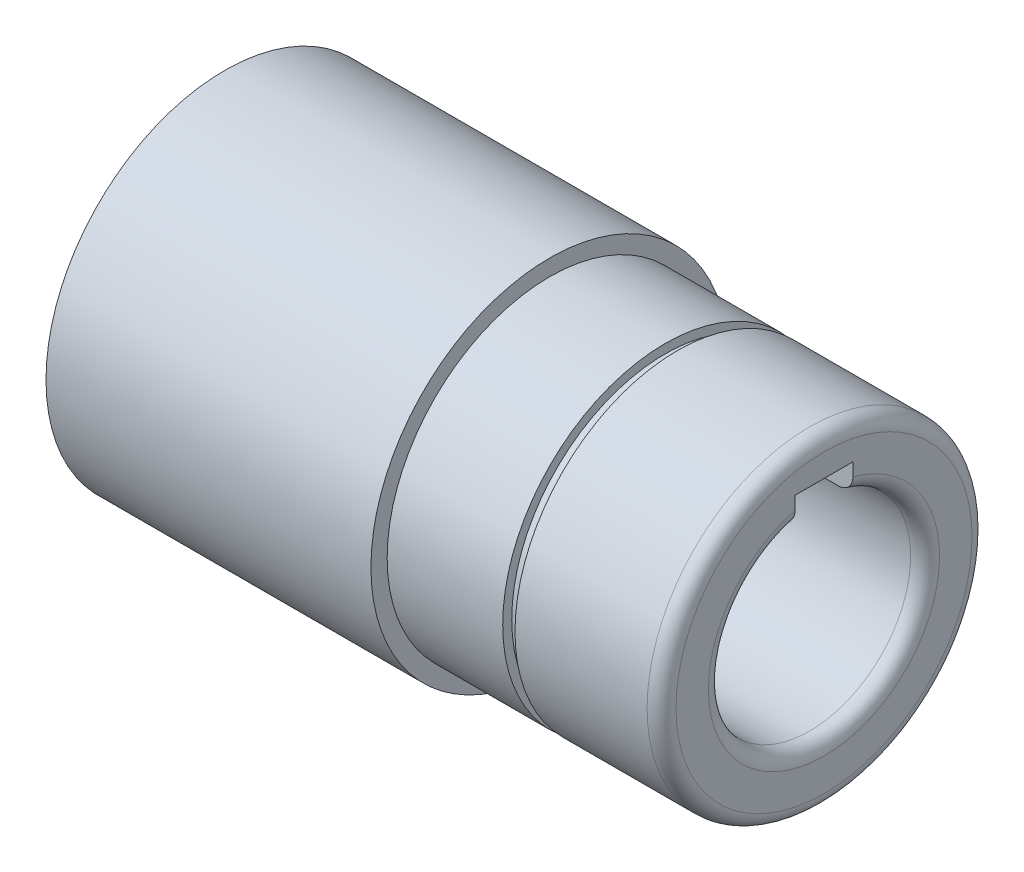
ISO-10303-21;
HEADER;
FILE_DESCRIPTION(('STEP AP214'),'2;1');
FILE_NAME('part.step','',(''),(''),'','','');
FILE_SCHEMA(('AUTOMOTIVE_DESIGN { 1 0 10303 214 1 1 1 1 }'));
ENDSEC;
DATA;
#1=APPLICATION_CONTEXT('core data for automotive mechanical design processes');
#2=APPLICATION_PROTOCOL_DEFINITION('international standard','automotive_design',2000,#1);
#3=PRODUCT_CONTEXT('',#1,'mechanical');
#4=PRODUCT('Part','Part','',(#3));
#5=PRODUCT_RELATED_PRODUCT_CATEGORY('part','',(#4));
#6=PRODUCT_DEFINITION_FORMATION('','',#4);
#7=PRODUCT_DEFINITION_CONTEXT('part definition',#1,'design');
#8=PRODUCT_DEFINITION('design','',#6,#7);
#9=PRODUCT_DEFINITION_SHAPE('','',#8);
#10=(LENGTH_UNIT() NAMED_UNIT(*) SI_UNIT(.MILLI.,.METRE.));
#11=(NAMED_UNIT(*) PLANE_ANGLE_UNIT() SI_UNIT($,.RADIAN.));
#12=(NAMED_UNIT(*) SI_UNIT($,.STERADIAN.) SOLID_ANGLE_UNIT());
#13=UNCERTAINTY_MEASURE_WITH_UNIT(LENGTH_MEASURE(1.E-05),#10,'distance_accuracy_value','');
#14=(GEOMETRIC_REPRESENTATION_CONTEXT(3) GLOBAL_UNCERTAINTY_ASSIGNED_CONTEXT((#13)) GLOBAL_UNIT_ASSIGNED_CONTEXT((#10,
#11,#12)) REPRESENTATION_CONTEXT('',''));
#15=CARTESIAN_POINT('',(0.,0.,0.));
#16=DIRECTION('',(0.,0.,1.));
#17=DIRECTION('',(1.,0.,0.));
#18=AXIS2_PLACEMENT_3D('',#15,#16,#17);
#19=CARTESIAN_POINT('',(-32.6241134751773,0.,0.));
#20=DIRECTION('',(-1.,0.,0.));
#21=DIRECTION('',(0.,0.,1.));
#22=AXIS2_PLACEMENT_3D('',#19,#20,#21);
#23=CYLINDRICAL_SURFACE('',#22,10.);
#24=CARTESIAN_POINT('',(0.,0.,0.));
#25=DIRECTION('',(-1.,0.,0.));
#26=DIRECTION('',(0.,0.,1.));
#27=AXIS2_PLACEMENT_3D('',#24,#25,#26);
#28=CIRCLE('',#27,10.);
#29=CARTESIAN_POINT('',(0.,9.68245836551854,-2.5));
#30=VERTEX_POINT('',#29);
#31=CARTESIAN_POINT('',(0.,9.68245836551854,2.5));
#32=VERTEX_POINT('',#31);
#33=EDGE_CURVE('E314',#30,#32,#28,.T.);
#34=ORIENTED_EDGE('',*,*,#33,.T.);
#35=DIRECTION('',(-1.,0.,0.));
#36=VECTOR('',#35,1.);
#37=CARTESIAN_POINT('',(-32.6241134751773,9.68245836551854,2.5));
#38=LINE('',#37,#36);
#39=CARTESIAN_POINT('',(22.5,9.68245836551854,2.5));
#40=VERTEX_POINT('',#39);
#41=EDGE_CURVE('E294',#40,#32,#38,.T.);
#42=ORIENTED_EDGE('',*,*,#41,.F.);
#43=CARTESIAN_POINT('',(22.5,0.,0.));
#44=DIRECTION('',(-1.,0.,0.));
#45=DIRECTION('',(0.,0.,1.));
#46=AXIS2_PLACEMENT_3D('',#43,#44,#45);
#47=CIRCLE('',#46,10.);
#48=CARTESIAN_POINT('',(22.5,9.68245836551854,-2.5));
#49=VERTEX_POINT('',#48);
#50=EDGE_CURVE('E11',#49,#40,#47,.T.);
#51=ORIENTED_EDGE('',*,*,#50,.F.);
#52=DIRECTION('',(-1.,0.,0.));
#53=VECTOR('',#52,1.);
#54=CARTESIAN_POINT('',(-32.6241134751773,9.68245836551854,-2.5));
#55=LINE('',#54,#53);
#56=EDGE_CURVE('E292',#30,#49,#55,.F.);
#57=ORIENTED_EDGE('',*,*,#56,.F.);
#58=EDGE_LOOP('',(#34,#42,#51,#57));
#59=FACE_BOUND('',#58,.T.);
#60=ADVANCED_FACE('F34',(#59),#23,.F.);
#61=CARTESIAN_POINT('',(22.5,0.,-18.));
#62=DIRECTION('',(-1.,0.,0.));
#63=DIRECTION('',(0.,0.,1.));
#64=AXIS2_PLACEMENT_3D('',#61,#62,#63);
#65=PLANE('',#64);
#66=ORIENTED_EDGE('',*,*,#50,.T.);
#67=DIRECTION('',(0.,-1.,0.));
#68=VECTOR('',#67,1.);
#69=CARTESIAN_POINT('',(22.5,12.3,2.5));
#70=LINE('',#69,#68);
#71=CARTESIAN_POINT('',(22.5,12.3,2.5));
#72=VERTEX_POINT('',#71);
#73=EDGE_CURVE('E299',#72,#40,#70,.T.);
#74=ORIENTED_EDGE('',*,*,#73,.F.);
#75=DIRECTION('',(0.,0.,1.));
#76=VECTOR('',#75,1.);
#77=CARTESIAN_POINT('',(22.5,12.3,-2.5));
#78=LINE('',#77,#76);
#79=CARTESIAN_POINT('',(22.5,12.3,-2.5));
#80=VERTEX_POINT('',#79);
#81=EDGE_CURVE('E310',#80,#72,#78,.T.);
#82=ORIENTED_EDGE('',*,*,#81,.F.);
#83=DIRECTION('',(0.,1.,0.));
#84=VECTOR('',#83,1.);
#85=CARTESIAN_POINT('',(22.5,12.3,-2.5));
#86=LINE('',#85,#84);
#87=EDGE_CURVE('E296',#49,#80,#86,.T.);
#88=ORIENTED_EDGE('',*,*,#87,.F.);
#89=EDGE_LOOP('',(#66,#74,#82,#88));
#90=FACE_BOUND('',#89,.T.);
#91=CARTESIAN_POINT('',(22.5,0.,0.));
#92=DIRECTION('',(-1.,0.,0.));
#93=DIRECTION('',(0.,0.,1.));
#94=AXIS2_PLACEMENT_3D('',#91,#92,#93);
#95=CIRCLE('',#94,18.);
#96=CARTESIAN_POINT('',(22.5,0.,18.));
#97=VERTEX_POINT('',#96);
#98=EDGE_CURVE('E41',#97,#97,#95,.T.);
#99=ORIENTED_EDGE('',*,*,#98,.F.);
#100=EDGE_LOOP('',(#99));
#101=FACE_BOUND('',#100,.T.);
#102=ADVANCED_FACE('F163',(#90,#101),#65,.F.);
#103=CARTESIAN_POINT('',(-32.6241134751773,0.,0.));
#104=DIRECTION('',(-1.,0.,0.));
#105=DIRECTION('',(0.,0.,1.));
#106=AXIS2_PLACEMENT_3D('',#103,#104,#105);
#107=CYLINDRICAL_SURFACE('',#106,18.);
#108=CARTESIAN_POINT('',(34.5,0.,0.));
#109=DIRECTION('',(-1.,0.,0.));
#110=DIRECTION('',(0.,0.,1.));
#111=AXIS2_PLACEMENT_3D('',#108,#109,#110);
#112=CIRCLE('',#111,18.);
#113=CARTESIAN_POINT('',(34.5,0.,18.));
#114=VERTEX_POINT('',#113);
#115=EDGE_CURVE('E156',#114,#114,#112,.T.);
#116=ORIENTED_EDGE('',*,*,#115,.F.);
#117=EDGE_LOOP('',(#116));
#118=FACE_BOUND('',#117,.T.);
#119=ORIENTED_EDGE('',*,*,#98,.T.);
#120=EDGE_LOOP('',(#119));
#121=FACE_BOUND('',#120,.T.);
#122=ADVANCED_FACE('F161',(#118,#121),#107,.F.);
#123=CARTESIAN_POINT('',(34.5,0.,-14.25));
#124=DIRECTION('',(1.,0.,0.));
#125=DIRECTION('',(0.,0.,-1.));
#126=AXIS2_PLACEMENT_3D('',#123,#124,#125);
#127=PLANE('',#126);
#128=DIRECTION('',(0.,0.,-1.));
#129=VECTOR('',#128,1.);
#130=CARTESIAN_POINT('',(34.5,17.3,4.));
#131=LINE('',#130,#129);
#132=CARTESIAN_POINT('',(34.5,17.3,4.));
#133=VERTEX_POINT('',#132);
#134=CARTESIAN_POINT('',(34.5,17.3,-4.));
#135=VERTEX_POINT('',#134);
#136=EDGE_CURVE('E282',#133,#135,#131,.T.);
#137=ORIENTED_EDGE('',*,*,#136,.F.);
#138=DIRECTION('',(0.,1.,0.));
#139=VECTOR('',#138,1.);
#140=CARTESIAN_POINT('',(34.5,10.8681503864858,4.));
#141=LINE('',#140,#139);
#142=CARTESIAN_POINT('',(34.5,13.6770793665899,4.));
#143=VERTEX_POINT('',#142);
#144=EDGE_CURVE('E268',#143,#133,#141,.T.);
#145=ORIENTED_EDGE('',*,*,#144,.F.);
#146=CARTESIAN_POINT('',(34.5,0.,0.));
#147=DIRECTION('',(-1.,0.,0.));
#148=DIRECTION('',(0.,0.,1.));
#149=AXIS2_PLACEMENT_3D('',#146,#147,#148);
#150=CIRCLE('',#149,14.25);
#151=CARTESIAN_POINT('',(34.5,13.6770793665899,-4.));
#152=VERTEX_POINT('',#151);
#153=EDGE_CURVE('E153',#152,#143,#150,.T.);
#154=ORIENTED_EDGE('',*,*,#153,.F.);
#155=DIRECTION('',(0.,-1.,0.));
#156=VECTOR('',#155,1.);
#157=CARTESIAN_POINT('',(34.5,14.7,-4.));
#158=LINE('',#157,#156);
#159=EDGE_CURVE('E270',#135,#152,#158,.T.);
#160=ORIENTED_EDGE('',*,*,#159,.F.);
#161=EDGE_LOOP('',(#137,#145,#154,#160));
#162=FACE_BOUND('',#161,.T.);
#163=ORIENTED_EDGE('',*,*,#115,.T.);
#164=EDGE_LOOP('',(#163));
#165=FACE_BOUND('',#164,.T.);
#166=ADVANCED_FACE('F170',(#162,#165),#127,.F.);
#167=CARTESIAN_POINT('',(-32.6241134751773,0.,0.));
#168=DIRECTION('',(-1.,0.,0.));
#169=DIRECTION('',(0.,0.,1.));
#170=AXIS2_PLACEMENT_3D('',#167,#168,#169);
#171=CYLINDRICAL_SURFACE('',#170,14.25);
#172=ORIENTED_EDGE('',*,*,#153,.T.);
#173=DIRECTION('',(-1.,0.,0.));
#174=VECTOR('',#173,1.);
#175=CARTESIAN_POINT('',(-32.6241134751773,13.6770793665899,4.));
#176=LINE('',#175,#174);
#177=CARTESIAN_POINT('',(56.5,13.6770793665899,4.));
#178=VERTEX_POINT('',#177);
#179=EDGE_CURVE('E290',#178,#143,#176,.T.);
#180=ORIENTED_EDGE('',*,*,#179,.F.);
#181=CARTESIAN_POINT('',(56.5,0.,0.));
#182=DIRECTION('',(-1.,0.,0.));
#183=DIRECTION('',(0.,0.,1.));
#184=AXIS2_PLACEMENT_3D('',#181,#182,#183);
#185=CIRCLE('',#184,14.25);
#186=CARTESIAN_POINT('',(56.5,13.6770793665899,-4.));
#187=VERTEX_POINT('',#186);
#188=EDGE_CURVE('E150',#187,#178,#185,.T.);
#189=ORIENTED_EDGE('',*,*,#188,.F.);
#190=DIRECTION('',(-1.,0.,0.));
#191=VECTOR('',#190,1.);
#192=CARTESIAN_POINT('',(-32.6241134751773,13.6770793665899,-4.));
#193=LINE('',#192,#191);
#194=EDGE_CURVE('E276',#152,#187,#193,.F.);
#195=ORIENTED_EDGE('',*,*,#194,.F.);
#196=EDGE_LOOP('',(#172,#180,#189,#195));
#197=FACE_BOUND('',#196,.T.);
#198=ADVANCED_FACE('F177',(#197),#171,.F.);
#199=CARTESIAN_POINT('',(56.5,0.,-14.));
#200=DIRECTION('',(1.,0.,0.));
#201=DIRECTION('',(0.,0.,-1.));
#202=AXIS2_PLACEMENT_3D('',#199,#200,#201);
#203=PLANE('',#202);
#204=ORIENTED_EDGE('',*,*,#188,.T.);
#205=DIRECTION('',(0.,1.,0.));
#206=VECTOR('',#205,1.);
#207=CARTESIAN_POINT('',(56.5,10.8681503864858,4.));
#208=LINE('',#207,#206);
#209=CARTESIAN_POINT('',(56.5,13.4164078649987,4.));
#210=VERTEX_POINT('',#209);
#211=EDGE_CURVE('E288',#210,#178,#208,.T.);
#212=ORIENTED_EDGE('',*,*,#211,.F.);
#213=CARTESIAN_POINT('',(56.5,0.,0.));
#214=DIRECTION('',(-1.,0.,0.));
#215=DIRECTION('',(0.,0.,1.));
#216=AXIS2_PLACEMENT_3D('',#213,#214,#215);
#217=CIRCLE('',#216,14.);
#218=CARTESIAN_POINT('',(56.5,13.4164078649987,-4.));
#219=VERTEX_POINT('',#218);
#220=EDGE_CURVE('E141',#219,#210,#217,.T.);
#221=ORIENTED_EDGE('',*,*,#220,.F.);
#222=DIRECTION('',(0.,-1.,0.));
#223=VECTOR('',#222,1.);
#224=CARTESIAN_POINT('',(56.5,14.7,-4.));
#225=LINE('',#224,#223);
#226=EDGE_CURVE('E274',#187,#219,#225,.T.);
#227=ORIENTED_EDGE('',*,*,#226,.F.);
#228=EDGE_LOOP('',(#204,#212,#221,#227));
#229=FACE_BOUND('',#228,.T.);
#230=ADVANCED_FACE('F181',(#229),#203,.F.);
#231=CARTESIAN_POINT('',(-32.6241134751773,0.,0.));
#232=DIRECTION('',(-1.,0.,0.));
#233=DIRECTION('',(0.,0.,1.));
#234=AXIS2_PLACEMENT_3D('',#231,#232,#233);
#235=CYLINDRICAL_SURFACE('',#234,14.);
#236=ORIENTED_EDGE('',*,*,#220,.T.);
#237=DIRECTION('',(-1.,0.,0.));
#238=VECTOR('',#237,1.);
#239=CARTESIAN_POINT('',(-32.6241134751773,13.4164078649987,4.));
#240=LINE('',#239,#238);
#241=CARTESIAN_POINT('',(82.5,13.4164078649987,4.));
#242=VERTEX_POINT('',#241);
#243=EDGE_CURVE('E286',#242,#210,#240,.T.);
#244=ORIENTED_EDGE('',*,*,#243,.F.);
#245=CARTESIAN_POINT('',(82.5,0.,0.));
#246=DIRECTION('',(-1.,0.,0.));
#247=DIRECTION('',(0.,0.,1.));
#248=AXIS2_PLACEMENT_3D('',#245,#246,#247);
#249=CIRCLE('',#248,14.);
#250=CARTESIAN_POINT('',(82.5,13.4164078649987,-4.));
#251=VERTEX_POINT('',#250);
#252=EDGE_CURVE('E136',#251,#242,#249,.T.);
#253=ORIENTED_EDGE('',*,*,#252,.F.);
#254=DIRECTION('',(-1.,0.,0.));
#255=VECTOR('',#254,1.);
#256=CARTESIAN_POINT('',(-32.6241134751773,13.4164078649987,-4.));
#257=LINE('',#256,#255);
#258=EDGE_CURVE('E272',#219,#251,#257,.F.);
#259=ORIENTED_EDGE('',*,*,#258,.F.);
#260=EDGE_LOOP('',(#236,#244,#253,#259));
#261=FACE_BOUND('',#260,.T.);
#262=ADVANCED_FACE('F185',(#261),#235,.F.);
#263=CARTESIAN_POINT('',(82.5,0.,0.));
#264=DIRECTION('',(-1.,0.,0.));
#265=DIRECTION('',(0.,0.,1.));
#266=AXIS2_PLACEMENT_3D('',#263,#264,#265);
#267=TOROIDAL_SURFACE('',#266,16.,2.);
#268=ORIENTED_EDGE('',*,*,#252,.T.);
#269=CARTESIAN_POINT('',(82.8674010520756,13.4519200133806,4.));
#270=CARTESIAN_POINT('',(82.761274344297,13.4312340403272,4.));
#271=CARTESIAN_POINT('',(82.6533291587383,13.4194936832755,4.));
#272=CARTESIAN_POINT('',(82.4369290155772,13.4143847883017,4.));
#273=CARTESIAN_POINT('',(82.3284736504761,13.4210349915197,4.));
#274=CARTESIAN_POINT('',(82.1143084097023,13.4524763485855,4.));
#275=CARTESIAN_POINT('',(82.0085964893872,13.4772535657253,4.));
#276=CARTESIAN_POINT('',(81.802801526575,13.5440450198358,4.));
#277=CARTESIAN_POINT('',(81.7027176710119,13.5860567596857,4.));
#278=CARTESIAN_POINT('',(81.5099195701115,13.6863516194699,4.));
#279=CARTESIAN_POINT('',(81.4172806446751,13.7447792768297,4.));
#280=CARTESIAN_POINT('',(81.2427034610271,13.8758748917458,4.));
#281=CARTESIAN_POINT('',(81.1607669997035,13.9485452354667,4.));
#282=CARTESIAN_POINT('',(81.0069170662574,14.1086773792564,4.));
#283=CARTESIAN_POINT('',(80.9354410238817,14.1965592987689,4.));
#284=CARTESIAN_POINT('',(80.8076247810456,14.3827127884526,4.));
#285=CARTESIAN_POINT('',(80.7512874734425,14.4809863393656,4.));
#286=CARTESIAN_POINT('',(80.6532135470596,14.6890575304659,4.));
#287=CARTESIAN_POINT('',(80.6120967410743,14.7991475811626,4.));
#288=CARTESIAN_POINT('',(80.5484682859433,15.0245824359095,4.));
#289=CARTESIAN_POINT('',(80.5259592234604,15.1399279681735,4.));
#290=CARTESIAN_POINT('',(80.4998288145878,15.3753603994814,4.));
#291=CARTESIAN_POINT('',(80.4966406527739,15.4954956545334,4.));
#292=CARTESIAN_POINT('',(80.5104743914477,15.7346050465182,4.));
#293=CARTESIAN_POINT('',(80.5274969499437,15.8535791455196,4.));
#294=CARTESIAN_POINT('',(80.5814295158547,16.0869133850876,4.));
#295=CARTESIAN_POINT('',(80.6183347256076,16.2012746315778,4.));
#296=CARTESIAN_POINT('',(80.7111894174522,16.4219944285739,4.));
#297=CARTESIAN_POINT('',(80.7671372586146,16.5283536676596,4.));
#298=CARTESIAN_POINT('',(80.8954165498016,16.7278221209622,4.));
#299=CARTESIAN_POINT('',(80.9674143042436,16.8211457874324,4.));
#300=CARTESIAN_POINT('',(81.1264603900932,16.9939480563613,4.));
#301=CARTESIAN_POINT('',(81.2135064147346,17.0734287770777,4.));
#302=CARTESIAN_POINT('',(81.3976106045359,17.2139601493699,4.));
#303=CARTESIAN_POINT('',(81.4943282922281,17.2754568695484,4.));
#304=CARTESIAN_POINT('',(81.6969159331089,17.3808625881787,4.));
#305=CARTESIAN_POINT('',(81.802784508469,17.4247742287872,4.));
#306=CARTESIAN_POINT('',(82.0178649592877,17.4926903133008,4.));
#307=CARTESIAN_POINT('',(82.1269311397418,17.5171566176771,4.));
#308=CARTESIAN_POINT('',(82.3476347393708,17.5471508784149,4.));
#309=CARTESIAN_POINT('',(82.4592719126751,17.5526806382176,4.));
#310=CARTESIAN_POINT('',(82.6803363367817,17.5446776435092,4.));
#311=CARTESIAN_POINT('',(82.7897730214005,17.5314024894049,4.));
#312=CARTESIAN_POINT('',(83.0048627215194,17.4866805162246,4.));
#313=CARTESIAN_POINT('',(83.110515808663,17.455234041421,4.));
#314=CARTESIAN_POINT('',(83.3151913510361,17.3751278904309,4.));
#315=CARTESIAN_POINT('',(83.4142072639778,17.3264515190103,4.));
#316=CARTESIAN_POINT('',(83.602821512772,17.2133993212527,4.));
#317=CARTESIAN_POINT('',(83.6924193259608,17.1490226242733,4.));
#318=CARTESIAN_POINT('',(83.8611281825199,17.0054299915374,4.));
#319=CARTESIAN_POINT('',(83.9400631368537,16.9260072978463,4.));
#320=CARTESIAN_POINT('',(84.0838636880552,16.7553170363775,4.));
#321=CARTESIAN_POINT('',(84.1487277367308,16.6640481669541,4.));
#322=CARTESIAN_POINT('',(84.2642645545866,16.4698762120727,4.));
#323=CARTESIAN_POINT('',(84.3145492499086,16.3667422742237,4.));
#324=CARTESIAN_POINT('',(84.3976042700096,16.1536508625204,4.));
#325=CARTESIAN_POINT('',(84.4303721135195,16.0436924244337,4.));
#326=CARTESIAN_POINT('',(84.4783519444852,15.816921631037,4.));
#327=CARTESIAN_POINT('',(84.4930692984367,15.7000045375032,4.));
#328=CARTESIAN_POINT('',(84.503067998073,15.4653390378261,4.));
#329=CARTESIAN_POINT('',(84.4983468723469,15.3475905278765,4.));
#330=CARTESIAN_POINT('',(84.4693756728396,15.1122315693777,4.));
#331=CARTESIAN_POINT('',(84.4447549329162,14.9946665665284,4.));
#332=CARTESIAN_POINT('',(84.3761526592329,14.7653209425943,4.));
#333=CARTESIAN_POINT('',(84.3321707840202,14.6535404235636,4.));
#334=CARTESIAN_POINT('',(84.225890438059,14.4389401231663,4.));
#335=CARTESIAN_POINT('',(84.1635789198825,14.3361267926549,4.));
#336=CARTESIAN_POINT('',(84.0221859072179,14.1427006799417,4.));
#337=CARTESIAN_POINT('',(83.9431017099971,14.0520898678935,4.));
#338=CARTESIAN_POINT('',(83.7721987382153,13.8879581596425,4.));
#339=CARTESIAN_POINT('',(83.6807007575163,13.8141032399284,4.));
#340=CARTESIAN_POINT('',(83.4862639654933,13.683617615805,4.));
#341=CARTESIAN_POINT('',(83.3833429047226,13.6269606849788,4.));
#342=CARTESIAN_POINT('',(83.2107476036422,13.5511703807115,4.));
#343=CARTESIAN_POINT('',(83.1436589351841,13.5260060120997,4.));
#344=CARTESIAN_POINT('',(83.0071127919515,13.4832278220931,4.));
#345=CARTESIAN_POINT('',(82.9376553728083,13.465613823506,4.));
#346=CARTESIAN_POINT('',(82.8674010520756,13.4519200133806,4.));
#347=B_SPLINE_CURVE_WITH_KNOTS('',3,(#269,#270,#271,#272,#273,#274,#275,#276,#277,#278,#279,
#280,#281,#282,#283,#284,#285,#286,#287,#288,#289,#290,#291,#292,#293,#294,#295,#296,#297,#298,
#299,#300,#301,#302,#303,#304,#305,#306,#307,#308,#309,#310,#311,#312,#313,#314,#315,#316,#317,
#318,#319,#320,#321,#322,#323,#324,#325,#326,#327,#328,#329,#330,#331,#332,#333,#334,#335,#336,
#337,#338,#339,#340,#341,#342,#343,#344,#345,#346),.UNSPECIFIED.,.T.,.F.,(4,2,2,2,2,2,2,2,2,2,2,
2,2,2,2,2,2,2,2,2,2,2,2,2,2,2,2,2,2,2,2,2,2,2,2,2,2,2,4),(0.,0.324109945251394,
0.648550300642058,0.972741476269301,1.29688569621395,1.62397851773955,1.95112618605129,
2.28943732754836,2.62781307094488,2.97875307546865,3.32974185596894,3.68857171302433,
4.04741325296278,4.40616824358718,4.7648923276341,5.11675784186084,5.46856946597655,
5.81072255727388,6.15282422079194,6.48653491117558,6.82021381939959,7.14936575700735,
7.47851145873532,7.80797696943192,8.13746075439076,8.47185245921628,8.80628093781319,
9.14893087835958,9.49162934255578,9.84352279672773,10.1954609920633,10.5541100305456,
10.9127653944122,11.2716766771057,11.6306458384082,11.9816655463771,12.3321472390119,
12.5467082947046,12.7612643147954),.UNSPECIFIED.);
#348=CARTESIAN_POINT('',(84.5,15.4919333848297,4.));
#349=VERTEX_POINT('',#348);
#350=EDGE_CURVE('E120',#349,#242,#347,.T.);
#351=ORIENTED_EDGE('',*,*,#350,.F.);
#352=CARTESIAN_POINT('',(84.5,0.,0.));
#353=DIRECTION('',(-1.,0.,0.));
#354=DIRECTION('',(0.,0.,1.));
#355=AXIS2_PLACEMENT_3D('',#352,#353,#354);
#356=CIRCLE('',#355,16.);
#357=CARTESIAN_POINT('',(84.5,15.4919333848297,-4.));
#358=VERTEX_POINT('',#357);
#359=EDGE_CURVE('E134',#358,#349,#356,.T.);
#360=ORIENTED_EDGE('',*,*,#359,.F.);
#361=CARTESIAN_POINT('',(82.8674010520756,13.4519200133806,-4.));
#362=CARTESIAN_POINT('',(82.9760822774872,13.4731155272315,-4.));
#363=CARTESIAN_POINT('',(83.0830213944465,13.5037268442409,-4.));
#364=CARTESIAN_POINT('',(83.2902421139963,13.5826872174993,-4.));
#365=CARTESIAN_POINT('',(83.3905137615886,13.6310621235132,-4.));
#366=CARTESIAN_POINT('',(83.5813880552198,13.7437536540675,-4.));
#367=CARTESIAN_POINT('',(83.6720089574776,13.8080393855488,-4.));
#368=CARTESIAN_POINT('',(83.8414974737444,13.9505180564907,-4.));
#369=CARTESIAN_POINT('',(83.9203673914469,14.0287082634712,-4.));
#370=CARTESIAN_POINT('',(84.0664664166344,14.1989369837235,-4.));
#371=CARTESIAN_POINT('',(84.133331804646,14.2912874770044,-4.));
#372=CARTESIAN_POINT('',(84.2512475187746,14.4855895036998,-4.));
#373=CARTESIAN_POINT('',(84.3022944212211,14.5875431093443,-4.));
#374=CARTESIAN_POINT('',(84.3889531866463,14.8020839498235,-4.));
#375=CARTESIAN_POINT('',(84.4239466289929,14.9149212744867,-4.));
#376=CARTESIAN_POINT('',(84.4748870889229,15.1448212376964,-4.));
#377=CARTESIAN_POINT('',(84.4908316673029,15.2618844153858,-4.));
#378=CARTESIAN_POINT('',(84.5033533007556,15.4992433296278,-4.));
#379=CARTESIAN_POINT('',(84.499563748765,15.6195586443202,-4.));
#380=CARTESIAN_POINT('',(84.4717619330653,15.8578377693706,-4.));
#381=CARTESIAN_POINT('',(84.4477495350554,15.9758015641067,-4.));
#382=CARTESIAN_POINT('',(84.3801352127833,16.2054684763877,-4.));
#383=CARTESIAN_POINT('',(84.3366128701075,16.3171949745818,-4.));
#384=CARTESIAN_POINT('',(84.2310281521174,16.5315237774226,-4.));
#385=CARTESIAN_POINT('',(84.1689676447006,16.6341269999756,-4.));
#386=CARTESIAN_POINT('',(84.0294353824337,16.8249000097975,-4.));
#387=CARTESIAN_POINT('',(83.9523219833048,16.913331758767,-4.));
#388=CARTESIAN_POINT('',(83.7839635686729,17.0755340340117,-4.));
#389=CARTESIAN_POINT('',(83.6927207900315,17.1493068767657,-4.));
#390=CARTESIAN_POINT('',(83.5014158043546,17.2779305838116,-4.));
#391=CARTESIAN_POINT('',(83.4016678485047,17.3332489211642,-4.));
#392=CARTESIAN_POINT('',(83.1941402694425,17.4258963032506,-4.));
#393=CARTESIAN_POINT('',(83.0863618006215,17.4632279278475,-4.));
#394=CARTESIAN_POINT('',(82.868516500375,17.5180090056907,-4.));
#395=CARTESIAN_POINT('',(82.7585599374637,17.5358975558476,-4.));
#396=CARTESIAN_POINT('',(82.5372092802487,17.5527291760254,-4.));
#397=CARTESIAN_POINT('',(82.4258153057835,17.5516738153513,-4.));
#398=CARTESIAN_POINT('',(82.2060694358347,17.530773773712,-4.));
#399=CARTESIAN_POINT('',(82.0976974513395,17.5111393564905,-4.));
#400=CARTESIAN_POINT('',(81.8857721551317,17.4540151396379,-4.));
#401=CARTESIAN_POINT('',(81.782218817994,17.4165254342301,-4.));
#402=CARTESIAN_POINT('',(81.5824334496351,17.324705791707,-4.));
#403=CARTESIAN_POINT('',(81.4862285681544,17.2703168445179,-4.));
#404=CARTESIAN_POINT('',(81.3041170501415,17.1464144020426,-4.));
#405=CARTESIAN_POINT('',(81.2182110954408,17.0768999062392,-4.));
#406=CARTESIAN_POINT('',(81.057533257962,16.9235090460007,-4.));
#407=CARTESIAN_POINT('',(80.9829750297015,16.839409005095,-4.));
#408=CARTESIAN_POINT('',(80.8486170794749,16.6601539707031,-4.));
#409=CARTESIAN_POINT('',(80.7888191118864,16.5649976650644,-4.));
#410=CARTESIAN_POINT('',(80.6840380985877,16.3637416759247,-4.));
#411=CARTESIAN_POINT('',(80.6394733202024,16.2574242660467,-4.));
#412=CARTESIAN_POINT('',(80.5683107807761,16.0389398236014,-4.));
#413=CARTESIAN_POINT('',(80.5417155202811,15.9267719792561,-4.));
#414=CARTESIAN_POINT('',(80.5065650288557,15.6966249825754,-4.));
#415=CARTESIAN_POINT('',(80.4985018145004,15.5785705746247,-4.));
#416=CARTESIAN_POINT('',(80.5019566842476,15.3427438648294,-4.));
#417=CARTESIAN_POINT('',(80.513477153864,15.224971599103,-4.));
#418=CARTESIAN_POINT('',(80.5561194856754,14.9909998659439,-4.));
#419=CARTESIAN_POINT('',(80.5875634067412,14.8748589175986,-4.));
#420=CARTESIAN_POINT('',(80.6695553225917,14.6495154447173,-4.));
#421=CARTESIAN_POINT('',(80.7201039681933,14.5403131567001,-4.));
#422=CARTESIAN_POINT('',(80.8388727354995,14.3324165282619,-4.));
#423=CARTESIAN_POINT('',(80.90703741723,14.2336905682894,-4.));
#424=CARTESIAN_POINT('',(81.0593863223145,14.0494768158685,-4.));
#425=CARTESIAN_POINT('',(81.1435679018302,13.9639868428328,-4.));
#426=CARTESIAN_POINT('',(81.3232617950733,13.8112065163151,-4.));
#427=CARTESIAN_POINT('',(81.4184148510655,13.7434940149214,-4.));
#428=CARTESIAN_POINT('',(81.619140374947,13.6257567977291,-4.));
#429=CARTESIAN_POINT('',(81.7247129748626,13.5757323060927,-4.));
#430=CARTESIAN_POINT('',(81.9388352814999,13.4968606968744,-4.));
#431=CARTESIAN_POINT('',(82.0471109626514,13.4672678557536,-4.));
#432=CARTESIAN_POINT('',(82.2670534813596,13.4273535843056,-4.));
#433=CARTESIAN_POINT('',(82.3787148674247,13.4170026887392,-4.));
#434=CARTESIAN_POINT('',(82.5535726700185,13.416109045487,-4.));
#435=CARTESIAN_POINT('',(82.6168041701762,13.4189266873435,-4.));
#436=CARTESIAN_POINT('',(82.7426802360386,13.4307790700922,-4.));
#437=CARTESIAN_POINT('',(82.8053248196924,13.4398136202266,-4.));
#438=CARTESIAN_POINT('',(82.8674010520756,13.4519200133806,-4.));
#439=B_SPLINE_CURVE_WITH_KNOTS('',3,(#361,#362,#363,#364,#365,#366,#367,#368,#369,#370,#371,
#372,#373,#374,#375,#376,#377,#378,#379,#380,#381,#382,#383,#384,#385,#386,#387,#388,#389,#390,
#391,#392,#393,#394,#395,#396,#397,#398,#399,#400,#401,#402,#403,#404,#405,#406,#407,#408,#409,
#410,#411,#412,#413,#414,#415,#416,#417,#418,#419,#420,#421,#422,#423,#424,#425,#426,#427,#428,
#429,#430,#431,#432,#433,#434,#435,#436,#437,#438),.UNSPECIFIED.,.T.,.F.,(4,2,2,2,2,2,2,2,2,2,2,
2,2,2,2,2,2,2,2,2,2,2,2,2,2,2,2,2,2,2,2,2,2,2,2,2,2,2,4),(0.,0.331945804188142,
0.664376586242411,0.996166903301627,1.32789208949172,1.6684048814519,2.00899132083457,
2.36177829157711,2.71461043178306,3.07402036158096,3.4334326782557,3.79139209751708,
4.14931546110188,4.49957661421803,4.8497823730958,5.19028886247981,5.530746497921,
5.8633444504066,6.19591485075808,6.5247659255446,6.85361526498768,7.18362606181559,
7.51365869467156,7.84929127759119,8.18496373399353,8.52922595256915,8.87353606705043,
9.22688680213144,9.58028058240786,9.93953794742848,10.298807551925,10.6569599723357,
11.0150533253264,11.3636599989575,11.7122710903593,12.0473691655515,12.3819536801846,
12.5715593554905,12.7611592132525),.UNSPECIFIED.);
#440=EDGE_CURVE('E48',#251,#358,#439,.T.);
#441=ORIENTED_EDGE('',*,*,#440,.F.);
#442=EDGE_LOOP('',(#268,#351,#360,#441));
#443=FACE_BOUND('',#442,.T.);
#444=ADVANCED_FACE('F133',(#443),#267,.T.);
#445=CARTESIAN_POINT('',(84.5,0.,-20.5));
#446=DIRECTION('',(-1.,0.,0.));
#447=DIRECTION('',(0.,0.,1.));
#448=AXIS2_PLACEMENT_3D('',#445,#446,#447);
#449=PLANE('',#448);
#450=CARTESIAN_POINT('',(84.5,0.,0.));
#451=DIRECTION('',(-1.,0.,0.));
#452=DIRECTION('',(0.,0.,1.));
#453=AXIS2_PLACEMENT_3D('',#450,#451,#452);
#454=CIRCLE('',#453,20.5);
#455=CARTESIAN_POINT('',(84.5,0.,20.5));
#456=VERTEX_POINT('',#455);
#457=EDGE_CURVE('E139',#456,#456,#454,.T.);
#458=ORIENTED_EDGE('',*,*,#457,.F.);
#459=EDGE_LOOP('',(#458));
#460=FACE_BOUND('',#459,.T.);
#461=ORIENTED_EDGE('',*,*,#359,.T.);
#462=DIRECTION('',(0.,-1.,0.));
#463=VECTOR('',#462,1.);
#464=CARTESIAN_POINT('',(84.5,10.8681503864858,4.));
#465=LINE('',#464,#463);
#466=CARTESIAN_POINT('',(84.5,17.3,4.));
#467=VERTEX_POINT('',#466);
#468=EDGE_CURVE('E116',#467,#349,#465,.T.);
#469=ORIENTED_EDGE('',*,*,#468,.F.);
#470=DIRECTION('',(0.,0.,1.));
#471=VECTOR('',#470,1.);
#472=CARTESIAN_POINT('',(84.5,17.3,4.));
#473=LINE('',#472,#471);
#474=CARTESIAN_POINT('',(84.5,17.3,-4.));
#475=VERTEX_POINT('',#474);
#476=EDGE_CURVE('E128',#475,#467,#473,.T.);
#477=ORIENTED_EDGE('',*,*,#476,.F.);
#478=DIRECTION('',(0.,1.,0.));
#479=VECTOR('',#478,1.);
#480=CARTESIAN_POINT('',(84.5,14.7,-4.));
#481=LINE('',#480,#479);
#482=EDGE_CURVE('E127',#358,#475,#481,.T.);
#483=ORIENTED_EDGE('',*,*,#482,.F.);
#484=EDGE_LOOP('',(#461,#469,#477,#483));
#485=FACE_BOUND('',#484,.T.);
#486=ADVANCED_FACE('F138',(#460,#485),#449,.F.);
#487=CARTESIAN_POINT('',(82.5,0.,0.));
#488=DIRECTION('',(-1.,0.,0.));
#489=DIRECTION('',(0.,0.,1.));
#490=AXIS2_PLACEMENT_3D('',#487,#488,#489);
#491=TOROIDAL_SURFACE('',#490,20.5,2.);
#492=CARTESIAN_POINT('',(82.5,0.,0.));
#493=DIRECTION('',(-1.,0.,0.));
#494=DIRECTION('',(0.,0.,1.));
#495=AXIS2_PLACEMENT_3D('',#492,#493,#494);
#496=CIRCLE('',#495,22.5);
#497=CARTESIAN_POINT('',(82.5,0.,22.5));
#498=VERTEX_POINT('',#497);
#499=EDGE_CURVE('E144',#498,#498,#496,.T.);
#500=ORIENTED_EDGE('',*,*,#499,.F.);
#501=EDGE_LOOP('',(#500));
#502=FACE_BOUND('',#501,.T.);
#503=ORIENTED_EDGE('',*,*,#457,.T.);
#504=EDGE_LOOP('',(#503));
#505=FACE_BOUND('',#504,.T.);
#506=ADVANCED_FACE('F194',(#502,#505),#491,.T.);
#507=CARTESIAN_POINT('',(-32.6241134751773,0.,0.));
#508=DIRECTION('',(-1.,0.,0.));
#509=DIRECTION('',(0.,0.,1.));
#510=AXIS2_PLACEMENT_3D('',#507,#508,#509);
#511=CYLINDRICAL_SURFACE('',#510,22.5);
#512=CARTESIAN_POINT('',(64.2,0.,0.));
#513=DIRECTION('',(-1.,0.,0.));
#514=DIRECTION('',(0.,0.,1.));
#515=AXIS2_PLACEMENT_3D('',#512,#513,#514);
#516=CIRCLE('',#515,22.5);
#517=CARTESIAN_POINT('',(64.2,0.,22.5));
#518=VERTEX_POINT('',#517);
#519=EDGE_CURVE('E341',#518,#518,#516,.T.);
#520=ORIENTED_EDGE('',*,*,#519,.F.);
#521=EDGE_LOOP('',(#520));
#522=FACE_BOUND('',#521,.T.);
#523=ORIENTED_EDGE('',*,*,#499,.T.);
#524=EDGE_LOOP('',(#523));
#525=FACE_BOUND('',#524,.T.);
#526=ADVANCED_FACE('F198',(#522,#525),#511,.T.);
#527=CARTESIAN_POINT('',(64.2,0.,-21.25));
#528=DIRECTION('',(1.,0.,0.));
#529=DIRECTION('',(0.,0.,-1.));
#530=AXIS2_PLACEMENT_3D('',#527,#528,#529);
#531=PLANE('',#530);
#532=CARTESIAN_POINT('',(64.2,0.,0.));
#533=DIRECTION('',(-1.,0.,0.));
#534=DIRECTION('',(0.,0.,1.));
#535=AXIS2_PLACEMENT_3D('',#532,#533,#534);
#536=CIRCLE('',#535,21.25);
#537=CARTESIAN_POINT('',(64.2,0.,21.25));
#538=VERTEX_POINT('',#537);
#539=EDGE_CURVE('E338',#538,#538,#536,.T.);
#540=ORIENTED_EDGE('',*,*,#539,.F.);
#541=EDGE_LOOP('',(#540));
#542=FACE_BOUND('',#541,.T.);
#543=ORIENTED_EDGE('',*,*,#519,.T.);
#544=EDGE_LOOP('',(#543));
#545=FACE_BOUND('',#544,.T.);
#546=ADVANCED_FACE('F202',(#542,#545),#531,.F.);
#547=CARTESIAN_POINT('',(-32.6241134751773,0.,0.));
#548=DIRECTION('',(-1.,0.,0.));
#549=DIRECTION('',(0.,0.,1.));
#550=AXIS2_PLACEMENT_3D('',#547,#548,#549);
#551=CYLINDRICAL_SURFACE('',#550,21.25);
#552=CARTESIAN_POINT('',(62.5,0.,0.));
#553=DIRECTION('',(-1.,0.,0.));
#554=DIRECTION('',(0.,0.,1.));
#555=AXIS2_PLACEMENT_3D('',#552,#553,#554);
#556=CIRCLE('',#555,21.25);
#557=CARTESIAN_POINT('',(62.5,0.,21.25));
#558=VERTEX_POINT('',#557);
#559=EDGE_CURVE('E335',#558,#558,#556,.T.);
#560=ORIENTED_EDGE('',*,*,#559,.F.);
#561=EDGE_LOOP('',(#560));
#562=FACE_BOUND('',#561,.T.);
#563=ORIENTED_EDGE('',*,*,#539,.T.);
#564=EDGE_LOOP('',(#563));
#565=FACE_BOUND('',#564,.T.);
#566=ADVANCED_FACE('F206',(#562,#565),#551,.T.);
#567=CARTESIAN_POINT('',(62.5,0.,-22.5));
#568=DIRECTION('',(-1.,0.,0.));
#569=DIRECTION('',(0.,0.,1.));
#570=AXIS2_PLACEMENT_3D('',#567,#568,#569);
#571=PLANE('',#570);
#572=CARTESIAN_POINT('',(62.5,0.,0.));
#573=DIRECTION('',(-1.,0.,0.));
#574=DIRECTION('',(0.,0.,1.));
#575=AXIS2_PLACEMENT_3D('',#572,#573,#574);
#576=CIRCLE('',#575,22.5);
#577=CARTESIAN_POINT('',(62.5,0.,22.5));
#578=VERTEX_POINT('',#577);
#579=EDGE_CURVE('E332',#578,#578,#576,.T.);
#580=ORIENTED_EDGE('',*,*,#579,.F.);
#581=EDGE_LOOP('',(#580));
#582=FACE_BOUND('',#581,.T.);
#583=ORIENTED_EDGE('',*,*,#559,.T.);
#584=EDGE_LOOP('',(#583));
#585=FACE_BOUND('',#584,.T.);
#586=ADVANCED_FACE('F210',(#582,#585),#571,.F.);
#587=CARTESIAN_POINT('',(-32.6241134751773,0.,0.));
#588=DIRECTION('',(-1.,0.,0.));
#589=DIRECTION('',(0.,0.,1.));
#590=AXIS2_PLACEMENT_3D('',#587,#588,#589);
#591=CYLINDRICAL_SURFACE('',#590,22.5);
#592=CARTESIAN_POINT('',(46.5,0.,0.));
#593=DIRECTION('',(-1.,0.,0.));
#594=DIRECTION('',(0.,0.,1.));
#595=AXIS2_PLACEMENT_3D('',#592,#593,#594);
#596=CIRCLE('',#595,22.5);
#597=CARTESIAN_POINT('',(46.5,0.,22.5));
#598=VERTEX_POINT('',#597);
#599=EDGE_CURVE('E329',#598,#598,#596,.T.);
#600=ORIENTED_EDGE('',*,*,#599,.F.);
#601=EDGE_LOOP('',(#600));
#602=FACE_BOUND('',#601,.T.);
#603=ORIENTED_EDGE('',*,*,#579,.T.);
#604=EDGE_LOOP('',(#603));
#605=FACE_BOUND('',#604,.T.);
#606=ADVANCED_FACE('F214',(#602,#605),#591,.T.);
#607=CARTESIAN_POINT('',(46.5,0.,-24.75));
#608=DIRECTION('',(-1.,0.,0.));
#609=DIRECTION('',(0.,0.,1.));
#610=AXIS2_PLACEMENT_3D('',#607,#608,#609);
#611=PLANE('',#610);
#612=CARTESIAN_POINT('',(46.5,0.,0.));
#613=DIRECTION('',(-1.,0.,0.));
#614=DIRECTION('',(0.,0.,1.));
#615=AXIS2_PLACEMENT_3D('',#612,#613,#614);
#616=CIRCLE('',#615,24.75);
#617=CARTESIAN_POINT('',(46.5,0.,24.75));
#618=VERTEX_POINT('',#617);
#619=EDGE_CURVE('E326',#618,#618,#616,.T.);
#620=ORIENTED_EDGE('',*,*,#619,.F.);
#621=EDGE_LOOP('',(#620));
#622=FACE_BOUND('',#621,.T.);
#623=ORIENTED_EDGE('',*,*,#599,.T.);
#624=EDGE_LOOP('',(#623));
#625=FACE_BOUND('',#624,.T.);
#626=ADVANCED_FACE('F218',(#622,#625),#611,.F.);
#627=CARTESIAN_POINT('',(-32.6241134751773,0.,0.));
#628=DIRECTION('',(-1.,0.,0.));
#629=DIRECTION('',(0.,0.,1.));
#630=AXIS2_PLACEMENT_3D('',#627,#628,#629);
#631=CYLINDRICAL_SURFACE('',#630,24.75);
#632=CARTESIAN_POINT('',(1.5,0.,0.));
#633=DIRECTION('',(-1.,0.,0.));
#634=DIRECTION('',(0.,0.,1.));
#635=AXIS2_PLACEMENT_3D('',#632,#633,#634);
#636=CIRCLE('',#635,24.75);
#637=CARTESIAN_POINT('',(1.5,0.,24.75));
#638=VERTEX_POINT('',#637);
#639=EDGE_CURVE('E323',#638,#638,#636,.T.);
#640=ORIENTED_EDGE('',*,*,#639,.F.);
#641=EDGE_LOOP('',(#640));
#642=FACE_BOUND('',#641,.T.);
#643=ORIENTED_EDGE('',*,*,#619,.T.);
#644=EDGE_LOOP('',(#643));
#645=FACE_BOUND('',#644,.T.);
#646=ADVANCED_FACE('F222',(#642,#645),#631,.T.);
#647=CARTESIAN_POINT('',(1.5,0.,-14.));
#648=DIRECTION('',(1.,0.,0.));
#649=DIRECTION('',(0.,0.,-1.));
#650=AXIS2_PLACEMENT_3D('',#647,#648,#649);
#651=PLANE('',#650);
#652=CARTESIAN_POINT('',(1.5,0.,0.));
#653=DIRECTION('',(-1.,0.,0.));
#654=DIRECTION('',(0.,0.,1.));
#655=AXIS2_PLACEMENT_3D('',#652,#653,#654);
#656=CIRCLE('',#655,14.);
#657=CARTESIAN_POINT('',(1.5,0.,14.));
#658=VERTEX_POINT('',#657);
#659=EDGE_CURVE('E320',#658,#658,#656,.T.);
#660=ORIENTED_EDGE('',*,*,#659,.F.);
#661=EDGE_LOOP('',(#660));
#662=FACE_BOUND('',#661,.T.);
#663=ORIENTED_EDGE('',*,*,#639,.T.);
#664=EDGE_LOOP('',(#663));
#665=FACE_BOUND('',#664,.T.);
#666=ADVANCED_FACE('F226',(#662,#665),#651,.F.);
#667=CARTESIAN_POINT('',(-32.6241134751773,0.,0.));
#668=DIRECTION('',(-1.,0.,0.));
#669=DIRECTION('',(0.,0.,1.));
#670=AXIS2_PLACEMENT_3D('',#667,#668,#669);
#671=CYLINDRICAL_SURFACE('',#670,14.);
#672=CARTESIAN_POINT('',(0.,0.,0.));
#673=DIRECTION('',(-1.,0.,0.));
#674=DIRECTION('',(0.,0.,1.));
#675=AXIS2_PLACEMENT_3D('',#672,#673,#674);
#676=CIRCLE('',#675,14.);
#677=CARTESIAN_POINT('',(0.,0.,14.));
#678=VERTEX_POINT('',#677);
#679=EDGE_CURVE('E317',#678,#678,#676,.T.);
#680=ORIENTED_EDGE('',*,*,#679,.F.);
#681=EDGE_LOOP('',(#680));
#682=FACE_BOUND('',#681,.T.);
#683=ORIENTED_EDGE('',*,*,#659,.T.);
#684=EDGE_LOOP('',(#683));
#685=FACE_BOUND('',#684,.T.);
#686=ADVANCED_FACE('F230',(#682,#685),#671,.T.);
#687=CARTESIAN_POINT('',(0.,0.,-10.));
#688=DIRECTION('',(1.,0.,0.));
#689=DIRECTION('',(0.,0.,-1.));
#690=AXIS2_PLACEMENT_3D('',#687,#688,#689);
#691=PLANE('',#690);
#692=DIRECTION('',(0.,0.,-1.));
#693=VECTOR('',#692,1.);
#694=CARTESIAN_POINT('',(0.,12.3,-2.5));
#695=LINE('',#694,#693);
#696=CARTESIAN_POINT('',(0.,12.3,2.5));
#697=VERTEX_POINT('',#696);
#698=CARTESIAN_POINT('',(0.,12.3,-2.5));
#699=VERTEX_POINT('',#698);
#700=EDGE_CURVE('E302',#697,#699,#695,.T.);
#701=ORIENTED_EDGE('',*,*,#700,.F.);
#702=DIRECTION('',(0.,1.,0.));
#703=VECTOR('',#702,1.);
#704=CARTESIAN_POINT('',(0.,12.3,2.5));
#705=LINE('',#704,#703);
#706=EDGE_CURVE('E56',#32,#697,#705,.T.);
#707=ORIENTED_EDGE('',*,*,#706,.F.);
#708=ORIENTED_EDGE('',*,*,#33,.F.);
#709=DIRECTION('',(0.,-1.,0.));
#710=VECTOR('',#709,1.);
#711=CARTESIAN_POINT('',(0.,12.3,-2.5));
#712=LINE('',#711,#710);
#713=EDGE_CURVE('E305',#699,#30,#712,.T.);
#714=ORIENTED_EDGE('',*,*,#713,.F.);
#715=EDGE_LOOP('',(#701,#707,#708,#714));
#716=FACE_BOUND('',#715,.T.);
#717=ORIENTED_EDGE('',*,*,#679,.T.);
#718=EDGE_LOOP('',(#717));
#719=FACE_BOUND('',#718,.T.);
#720=ADVANCED_FACE('F234',(#716,#719),#691,.F.);
#721=CARTESIAN_POINT('',(84.501,12.3,2.5));
#722=DIRECTION('',(0.,0.,1.));
#723=DIRECTION('',(0.,-1.,0.));
#724=AXIS2_PLACEMENT_3D('',#721,#722,#723);
#725=PLANE('',#724);
#726=ORIENTED_EDGE('',*,*,#41,.T.);
#727=ORIENTED_EDGE('',*,*,#706,.T.);
#728=DIRECTION('',(-1.,0.,0.));
#729=VECTOR('',#728,1.);
#730=CARTESIAN_POINT('',(84.501,12.3,2.5));
#731=LINE('',#730,#729);
#732=EDGE_CURVE('E307',#72,#697,#731,.T.);
#733=ORIENTED_EDGE('',*,*,#732,.F.);
#734=ORIENTED_EDGE('',*,*,#73,.T.);
#735=EDGE_LOOP('',(#726,#727,#733,#734));
#736=FACE_BOUND('',#735,.T.);
#737=ADVANCED_FACE('F238',(#736),#725,.F.);
#738=CARTESIAN_POINT('',(84.501,12.3,-2.5));
#739=DIRECTION('',(0.,0.,-1.));
#740=DIRECTION('',(0.,1.,0.));
#741=AXIS2_PLACEMENT_3D('',#738,#739,#740);
#742=PLANE('',#741);
#743=ORIENTED_EDGE('',*,*,#56,.T.);
#744=ORIENTED_EDGE('',*,*,#87,.T.);
#745=DIRECTION('',(-1.,0.,0.));
#746=VECTOR('',#745,1.);
#747=CARTESIAN_POINT('',(84.501,12.3,-2.5));
#748=LINE('',#747,#746);
#749=EDGE_CURVE('E308',#80,#699,#748,.T.);
#750=ORIENTED_EDGE('',*,*,#749,.T.);
#751=ORIENTED_EDGE('',*,*,#713,.T.);
#752=EDGE_LOOP('',(#743,#744,#750,#751));
#753=FACE_BOUND('',#752,.T.);
#754=ADVANCED_FACE('F242',(#753),#742,.F.);
#755=CARTESIAN_POINT('',(84.501,12.3,-2.5));
#756=DIRECTION('',(0.,1.,0.));
#757=DIRECTION('',(0.,0.,1.));
#758=AXIS2_PLACEMENT_3D('',#755,#756,#757);
#759=PLANE('',#758);
#760=ORIENTED_EDGE('',*,*,#81,.T.);
#761=ORIENTED_EDGE('',*,*,#732,.T.);
#762=ORIENTED_EDGE('',*,*,#700,.T.);
#763=ORIENTED_EDGE('',*,*,#749,.F.);
#764=EDGE_LOOP('',(#760,#761,#762,#763));
#765=FACE_BOUND('',#764,.T.);
#766=ADVANCED_FACE('F243',(#765),#759,.F.);
#767=CARTESIAN_POINT('',(-0.001000000000001,17.3,4.));
#768=DIRECTION('',(0.,1.,0.));
#769=DIRECTION('',(0.,0.,1.));
#770=AXIS2_PLACEMENT_3D('',#767,#768,#769);
#771=PLANE('',#770);
#772=ORIENTED_EDGE('',*,*,#136,.T.);
#773=DIRECTION('',(1.,0.,0.));
#774=VECTOR('',#773,1.);
#775=CARTESIAN_POINT('',(-0.001000000000001,17.3,-4.));
#776=LINE('',#775,#774);
#777=EDGE_CURVE('E280',#135,#475,#776,.T.);
#778=ORIENTED_EDGE('',*,*,#777,.T.);
#779=ORIENTED_EDGE('',*,*,#476,.T.);
#780=DIRECTION('',(1.,0.,0.));
#781=VECTOR('',#780,1.);
#782=CARTESIAN_POINT('',(-0.001000000000001,17.3,4.));
#783=LINE('',#782,#781);
#784=EDGE_CURVE('E122',#133,#467,#783,.T.);
#785=ORIENTED_EDGE('',*,*,#784,.F.);
#786=EDGE_LOOP('',(#772,#778,#779,#785));
#787=FACE_BOUND('',#786,.T.);
#788=ADVANCED_FACE('F246',(#787),#771,.F.);
#789=CARTESIAN_POINT('',(-0.001000000000001,10.8681503864858,4.));
#790=DIRECTION('',(0.,0.,1.));
#791=DIRECTION('',(1.,0.,0.));
#792=AXIS2_PLACEMENT_3D('',#789,#790,#791);
#793=PLANE('',#792);
#794=ORIENTED_EDGE('',*,*,#144,.T.);
#795=ORIENTED_EDGE('',*,*,#784,.T.);
#796=ORIENTED_EDGE('',*,*,#468,.T.);
#797=ORIENTED_EDGE('',*,*,#350,.T.);
#798=ORIENTED_EDGE('',*,*,#243,.T.);
#799=ORIENTED_EDGE('',*,*,#211,.T.);
#800=ORIENTED_EDGE('',*,*,#179,.T.);
#801=EDGE_LOOP('',(#794,#795,#796,#797,#798,#799,#800));
#802=FACE_BOUND('',#801,.T.);
#803=ADVANCED_FACE('F119',(#802),#793,.F.);
#804=CARTESIAN_POINT('',(-0.001000000000001,14.7,-4.));
#805=DIRECTION('',(0.,0.,-1.));
#806=DIRECTION('',(-1.,0.,0.));
#807=AXIS2_PLACEMENT_3D('',#804,#805,#806);
#808=PLANE('',#807);
#809=ORIENTED_EDGE('',*,*,#159,.T.);
#810=ORIENTED_EDGE('',*,*,#194,.T.);
#811=ORIENTED_EDGE('',*,*,#226,.T.);
#812=ORIENTED_EDGE('',*,*,#258,.T.);
#813=ORIENTED_EDGE('',*,*,#440,.T.);
#814=ORIENTED_EDGE('',*,*,#482,.T.);
#815=ORIENTED_EDGE('',*,*,#777,.F.);
#816=EDGE_LOOP('',(#809,#810,#811,#812,#813,#814,#815));
#817=FACE_BOUND('',#816,.T.);
#818=ADVANCED_FACE('F257',(#817),#808,.F.);
#819=CLOSED_SHELL('',(#60,#102,#122,#166,#198,#230,#262,#444,#486,#506,#526,#546,#566,#586,#606,
#626,#646,#666,#686,#720,#737,#754,#766,#788,#803,#818));
#820=MANIFOLD_SOLID_BREP('B2',#819);
#821=ADVANCED_BREP_SHAPE_REPRESENTATION('',(#18,#820),#14);
#822=SHAPE_DEFINITION_REPRESENTATION(#9,#821);
ENDSEC;
END-ISO-10303-21;
